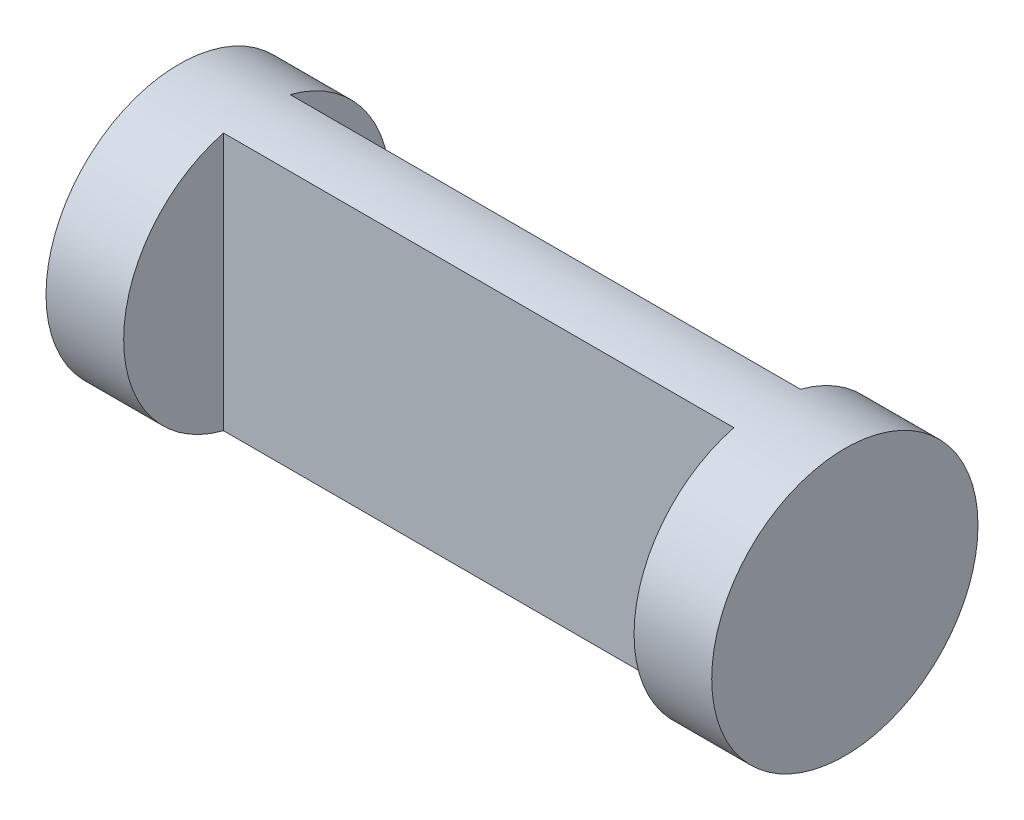
ISO-10303-21;
HEADER;
FILE_DESCRIPTION(('STEP AP214'),'2;1');
FILE_NAME('part.step','',(''),(''),'','','');
FILE_SCHEMA(('AUTOMOTIVE_DESIGN { 1 0 10303 214 1 1 1 1 }'));
ENDSEC;
DATA;
#1=APPLICATION_CONTEXT('core data for automotive mechanical design processes');
#2=APPLICATION_PROTOCOL_DEFINITION('international standard','automotive_design',2000,#1);
#3=PRODUCT_CONTEXT('',#1,'mechanical');
#4=PRODUCT('Part','Part','',(#3));
#5=PRODUCT_RELATED_PRODUCT_CATEGORY('part','',(#4));
#6=PRODUCT_DEFINITION_FORMATION('','',#4);
#7=PRODUCT_DEFINITION_CONTEXT('part definition',#1,'design');
#8=PRODUCT_DEFINITION('design','',#6,#7);
#9=PRODUCT_DEFINITION_SHAPE('','',#8);
#10=(LENGTH_UNIT() NAMED_UNIT(*) SI_UNIT(.MILLI.,.METRE.));
#11=(NAMED_UNIT(*) PLANE_ANGLE_UNIT() SI_UNIT($,.RADIAN.));
#12=(NAMED_UNIT(*) SI_UNIT($,.STERADIAN.) SOLID_ANGLE_UNIT());
#13=UNCERTAINTY_MEASURE_WITH_UNIT(LENGTH_MEASURE(1.E-05),#10,'distance_accuracy_value','');
#14=(GEOMETRIC_REPRESENTATION_CONTEXT(3) GLOBAL_UNCERTAINTY_ASSIGNED_CONTEXT((#13)) GLOBAL_UNIT_ASSIGNED_CONTEXT((#10,
#11,#12)) REPRESENTATION_CONTEXT('',''));
#15=CARTESIAN_POINT('',(0.,0.,0.));
#16=DIRECTION('',(0.,0.,1.));
#17=DIRECTION('',(1.,0.,0.));
#18=AXIS2_PLACEMENT_3D('',#15,#16,#17);
#19=CARTESIAN_POINT('',(0.,0.,0.));
#20=DIRECTION('',(-1.,0.,0.));
#21=DIRECTION('',(0.,0.,1.));
#22=AXIS2_PLACEMENT_3D('',#19,#20,#21);
#23=CYLINDRICAL_SURFACE('',#22,12.);
#24=CARTESIAN_POINT('',(53.,0.,0.));
#25=DIRECTION('',(-1.,0.,0.));
#26=DIRECTION('',(0.,0.,1.));
#27=AXIS2_PLACEMENT_3D('',#24,#25,#26);
#28=CIRCLE('',#27,12.);
#29=CARTESIAN_POINT('',(53.,11.6189500386222,3.));
#30=VERTEX_POINT('',#29);
#31=CARTESIAN_POINT('',(53.,-11.6189500386222,3.));
#32=VERTEX_POINT('',#31);
#33=EDGE_CURVE('E103',#30,#32,#28,.F.);
#34=ORIENTED_EDGE('',*,*,#33,.T.);
#35=DIRECTION('',(-1.,0.,0.));
#36=VECTOR('',#35,1.);
#37=CARTESIAN_POINT('',(84.9198715887542,-11.6189500386222,3.));
#38=LINE('',#37,#36);
#39=CARTESIAN_POINT('',(7.,-11.6189500386222,3.));
#40=VERTEX_POINT('',#39);
#41=EDGE_CURVE('E98',#32,#40,#38,.T.);
#42=ORIENTED_EDGE('',*,*,#41,.T.);
#43=CARTESIAN_POINT('',(7.,0.,0.));
#44=DIRECTION('',(1.,0.,0.));
#45=DIRECTION('',(0.,0.,-1.));
#46=AXIS2_PLACEMENT_3D('',#43,#44,#45);
#47=CIRCLE('',#46,12.);
#48=CARTESIAN_POINT('',(7.,11.6189500386222,3.));
#49=VERTEX_POINT('',#48);
#50=EDGE_CURVE('E99',#49,#40,#47,.T.);
#51=ORIENTED_EDGE('',*,*,#50,.F.);
#52=DIRECTION('',(-1.,0.,0.));
#53=VECTOR('',#52,1.);
#54=CARTESIAN_POINT('',(84.9198715887542,11.6189500386222,3.));
#55=LINE('',#54,#53);
#56=EDGE_CURVE('E104',#30,#49,#55,.T.);
#57=ORIENTED_EDGE('',*,*,#56,.F.);
#58=EDGE_LOOP('',(#34,#42,#51,#57));
#59=FACE_BOUND('',#58,.T.);
#60=CARTESIAN_POINT('',(0.,0.,0.));
#61=DIRECTION('',(-1.,0.,0.));
#62=DIRECTION('',(0.,0.,1.));
#63=AXIS2_PLACEMENT_3D('',#60,#61,#62);
#64=CIRCLE('',#63,12.);
#65=CARTESIAN_POINT('',(0.,0.,12.));
#66=VERTEX_POINT('',#65);
#67=EDGE_CURVE('E45',#66,#66,#64,.T.);
#68=ORIENTED_EDGE('',*,*,#67,.F.);
#69=EDGE_LOOP('',(#68));
#70=FACE_BOUND('',#69,.T.);
#71=CARTESIAN_POINT('',(60.,0.,0.));
#72=DIRECTION('',(-1.,0.,0.));
#73=DIRECTION('',(0.,0.,1.));
#74=AXIS2_PLACEMENT_3D('',#71,#72,#73);
#75=CIRCLE('',#74,12.);
#76=CARTESIAN_POINT('',(60.,0.,12.));
#77=VERTEX_POINT('',#76);
#78=EDGE_CURVE('E12',#77,#77,#75,.T.);
#79=ORIENTED_EDGE('',*,*,#78,.T.);
#80=EDGE_LOOP('',(#79));
#81=FACE_BOUND('',#80,.T.);
#82=CARTESIAN_POINT('',(53.,0.,0.));
#83=DIRECTION('',(-1.,0.,0.));
#84=DIRECTION('',(0.,0.,1.));
#85=AXIS2_PLACEMENT_3D('',#82,#83,#84);
#86=CIRCLE('',#85,12.);
#87=CARTESIAN_POINT('',(53.,11.6189500386222,-3.));
#88=VERTEX_POINT('',#87);
#89=CARTESIAN_POINT('',(53.,-11.6189500386222,-3.));
#90=VERTEX_POINT('',#89);
#91=EDGE_CURVE('E90',#88,#90,#86,.T.);
#92=ORIENTED_EDGE('',*,*,#91,.F.);
#93=DIRECTION('',(-1.,0.,0.));
#94=VECTOR('',#93,1.);
#95=CARTESIAN_POINT('',(84.9198715887542,11.6189500386222,-3.));
#96=LINE('',#95,#94);
#97=CARTESIAN_POINT('',(7.,11.6189500386222,-3.));
#98=VERTEX_POINT('',#97);
#99=EDGE_CURVE('E79',#88,#98,#96,.T.);
#100=ORIENTED_EDGE('',*,*,#99,.T.);
#101=CARTESIAN_POINT('',(7.,0.,0.));
#102=DIRECTION('',(1.,0.,0.));
#103=DIRECTION('',(0.,0.,-1.));
#104=AXIS2_PLACEMENT_3D('',#101,#102,#103);
#105=CIRCLE('',#104,12.);
#106=CARTESIAN_POINT('',(7.,-11.6189500386222,-3.));
#107=VERTEX_POINT('',#106);
#108=EDGE_CURVE('E84',#98,#107,#105,.F.);
#109=ORIENTED_EDGE('',*,*,#108,.T.);
#110=DIRECTION('',(-1.,0.,0.));
#111=VECTOR('',#110,1.);
#112=CARTESIAN_POINT('',(84.9198715887542,-11.6189500386222,-3.));
#113=LINE('',#112,#111);
#114=EDGE_CURVE('E82',#90,#107,#113,.T.);
#115=ORIENTED_EDGE('',*,*,#114,.F.);
#116=EDGE_LOOP('',(#92,#100,#109,#115));
#117=FACE_BOUND('',#116,.T.);
#118=ADVANCED_FACE('F37',(#59,#70,#81,#117),#23,.T.);
#119=CARTESIAN_POINT('',(0.,12.,0.));
#120=DIRECTION('',(1.,0.,0.));
#121=DIRECTION('',(0.,0.,-1.));
#122=AXIS2_PLACEMENT_3D('',#119,#120,#121);
#123=PLANE('',#122);
#124=ORIENTED_EDGE('',*,*,#67,.T.);
#125=EDGE_LOOP('',(#124));
#126=FACE_BOUND('',#125,.T.);
#127=ADVANCED_FACE('F39',(#126),#123,.F.);
#128=CARTESIAN_POINT('',(60.,0.,0.));
#129=DIRECTION('',(-1.,0.,0.));
#130=DIRECTION('',(0.,0.,1.));
#131=AXIS2_PLACEMENT_3D('',#128,#129,#130);
#132=PLANE('',#131);
#133=ORIENTED_EDGE('',*,*,#78,.F.);
#134=EDGE_LOOP('',(#133));
#135=FACE_BOUND('',#134,.T.);
#136=ADVANCED_FACE('F119',(#135),#132,.F.);
#137=CARTESIAN_POINT('',(84.9198715887542,0.,3.));
#138=DIRECTION('',(0.,0.,-1.));
#139=DIRECTION('',(-1.,0.,0.));
#140=AXIS2_PLACEMENT_3D('',#137,#138,#139);
#141=PLANE('',#140);
#142=DIRECTION('',(0.,1.,0.));
#143=VECTOR('',#142,1.);
#144=CARTESIAN_POINT('',(53.,0.,3.));
#145=LINE('',#144,#143);
#146=EDGE_CURVE('E101',#32,#30,#145,.T.);
#147=ORIENTED_EDGE('',*,*,#146,.T.);
#148=ORIENTED_EDGE('',*,*,#56,.T.);
#149=DIRECTION('',(0.,1.,0.));
#150=VECTOR('',#149,1.);
#151=CARTESIAN_POINT('',(7.,0.,3.));
#152=LINE('',#151,#150);
#153=EDGE_CURVE('E58',#40,#49,#152,.T.);
#154=ORIENTED_EDGE('',*,*,#153,.F.);
#155=ORIENTED_EDGE('',*,*,#41,.F.);
#156=EDGE_LOOP('',(#147,#148,#154,#155));
#157=FACE_BOUND('',#156,.T.);
#158=ADVANCED_FACE('F121',(#157),#141,.F.);
#159=CARTESIAN_POINT('',(53.,0.,0.));
#160=DIRECTION('',(-1.,0.,0.));
#161=DIRECTION('',(0.,0.,1.));
#162=AXIS2_PLACEMENT_3D('',#159,#160,#161);
#163=PLANE('',#162);
#164=ORIENTED_EDGE('',*,*,#146,.F.);
#165=ORIENTED_EDGE('',*,*,#33,.F.);
#166=EDGE_LOOP('',(#164,#165));
#167=FACE_BOUND('',#166,.T.);
#168=ADVANCED_FACE('F126',(#167),#163,.T.);
#169=CARTESIAN_POINT('',(7.,12.,0.));
#170=DIRECTION('',(1.,0.,0.));
#171=DIRECTION('',(0.,0.,-1.));
#172=AXIS2_PLACEMENT_3D('',#169,#170,#171);
#173=PLANE('',#172);
#174=ORIENTED_EDGE('',*,*,#50,.T.);
#175=ORIENTED_EDGE('',*,*,#153,.T.);
#176=EDGE_LOOP('',(#174,#175));
#177=FACE_BOUND('',#176,.T.);
#178=ADVANCED_FACE('F132',(#177),#173,.T.);
#179=CARTESIAN_POINT('',(84.9198715887542,0.,-3.));
#180=DIRECTION('',(0.,0.,-1.));
#181=DIRECTION('',(-1.,0.,0.));
#182=AXIS2_PLACEMENT_3D('',#179,#180,#181);
#183=PLANE('',#182);
#184=ORIENTED_EDGE('',*,*,#114,.T.);
#185=DIRECTION('',(0.,1.,0.));
#186=VECTOR('',#185,1.);
#187=CARTESIAN_POINT('',(7.,0.,-3.));
#188=LINE('',#187,#186);
#189=EDGE_CURVE('E51',#107,#98,#188,.T.);
#190=ORIENTED_EDGE('',*,*,#189,.T.);
#191=ORIENTED_EDGE('',*,*,#99,.F.);
#192=DIRECTION('',(0.,1.,0.));
#193=VECTOR('',#192,1.);
#194=CARTESIAN_POINT('',(53.,0.,-3.));
#195=LINE('',#194,#193);
#196=EDGE_CURVE('E96',#90,#88,#195,.T.);
#197=ORIENTED_EDGE('',*,*,#196,.F.);
#198=EDGE_LOOP('',(#184,#190,#191,#197));
#199=FACE_BOUND('',#198,.T.);
#200=ADVANCED_FACE('F77',(#199),#183,.T.);
#201=CARTESIAN_POINT('',(53.,0.,0.));
#202=DIRECTION('',(-1.,0.,0.));
#203=DIRECTION('',(0.,0.,1.));
#204=AXIS2_PLACEMENT_3D('',#201,#202,#203);
#205=PLANE('',#204);
#206=ORIENTED_EDGE('',*,*,#91,.T.);
#207=ORIENTED_EDGE('',*,*,#196,.T.);
#208=EDGE_LOOP('',(#206,#207));
#209=FACE_BOUND('',#208,.T.);
#210=ADVANCED_FACE('F138',(#209),#205,.T.);
#211=CARTESIAN_POINT('',(7.,12.,0.));
#212=DIRECTION('',(1.,0.,0.));
#213=DIRECTION('',(0.,0.,-1.));
#214=AXIS2_PLACEMENT_3D('',#211,#212,#213);
#215=PLANE('',#214);
#216=ORIENTED_EDGE('',*,*,#189,.F.);
#217=ORIENTED_EDGE('',*,*,#108,.F.);
#218=EDGE_LOOP('',(#216,#217));
#219=FACE_BOUND('',#218,.T.);
#220=ADVANCED_FACE('F86',(#219),#215,.T.);
#221=CLOSED_SHELL('',(#118,#127,#136,#158,#168,#178,#200,#210,#220));
#222=MANIFOLD_SOLID_BREP('B2',#221);
#223=ADVANCED_BREP_SHAPE_REPRESENTATION('',(#18,#222),#14);
#224=SHAPE_DEFINITION_REPRESENTATION(#9,#223);
ENDSEC;
END-ISO-10303-21;
